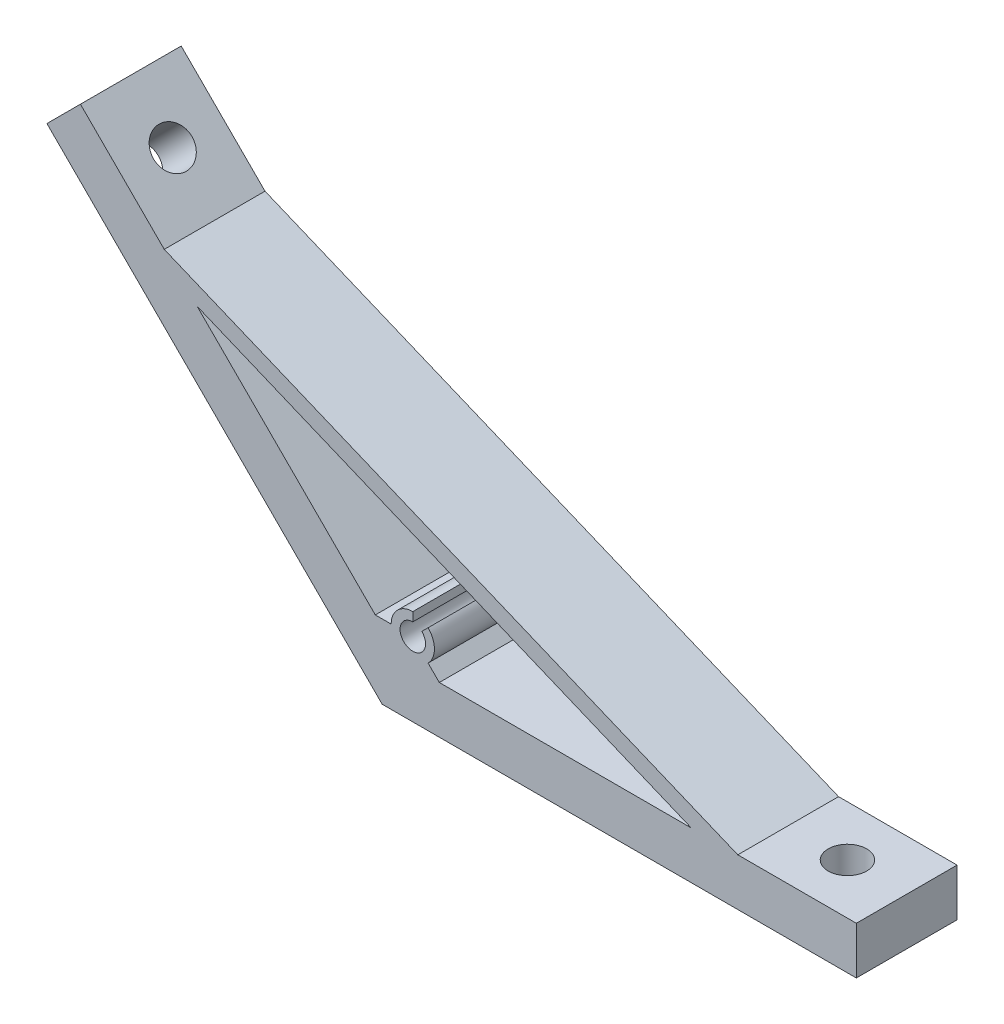
ISO-10303-21;
HEADER;
FILE_DESCRIPTION(('STEP AP214'),'2;1');
FILE_NAME('part.step','',(''),(''),'','','');
FILE_SCHEMA(('AUTOMOTIVE_DESIGN { 1 0 10303 214 1 1 1 1 }'));
ENDSEC;
DATA;
#1=APPLICATION_CONTEXT('core data for automotive mechanical design processes');
#2=APPLICATION_PROTOCOL_DEFINITION('international standard','automotive_design',2000,#1);
#3=PRODUCT_CONTEXT('',#1,'mechanical');
#4=PRODUCT('Part','Part','',(#3));
#5=PRODUCT_RELATED_PRODUCT_CATEGORY('part','',(#4));
#6=PRODUCT_DEFINITION_FORMATION('','',#4);
#7=PRODUCT_DEFINITION_CONTEXT('part definition',#1,'design');
#8=PRODUCT_DEFINITION('design','',#6,#7);
#9=PRODUCT_DEFINITION_SHAPE('','',#8);
#10=(LENGTH_UNIT() NAMED_UNIT(*) SI_UNIT(.MILLI.,.METRE.));
#11=(NAMED_UNIT(*) PLANE_ANGLE_UNIT() SI_UNIT($,.RADIAN.));
#12=(NAMED_UNIT(*) SI_UNIT($,.STERADIAN.) SOLID_ANGLE_UNIT());
#13=UNCERTAINTY_MEASURE_WITH_UNIT(LENGTH_MEASURE(1.E-05),#10,'distance_accuracy_value','');
#14=(GEOMETRIC_REPRESENTATION_CONTEXT(3) GLOBAL_UNCERTAINTY_ASSIGNED_CONTEXT((#13)) GLOBAL_UNIT_ASSIGNED_CONTEXT((#10,
#11,#12)) REPRESENTATION_CONTEXT('',''));
#15=CARTESIAN_POINT('',(0.,0.,0.));
#16=DIRECTION('',(0.,0.,1.));
#17=DIRECTION('',(1.,0.,0.));
#18=AXIS2_PLACEMENT_3D('',#15,#16,#17);
#19=CARTESIAN_POINT('',(-36.7695526216999,48.0832611206847,8.5));
#20=DIRECTION('',(-0.707106781186536,-0.707106781186559,0.));
#21=DIRECTION('',(0.707106781186559,-0.707106781186536,0.));
#22=AXIS2_PLACEMENT_3D('',#19,#20,#21);
#23=PLANE('',#22);
#24=DIRECTION('',(-0.707106781186559,0.707106781186536,0.));
#25=VECTOR('',#24,1.);
#26=CARTESIAN_POINT('',(-36.7695526216999,48.0832611206847,-8.5));
#27=LINE('',#26,#25);
#28=CARTESIAN_POINT('',(-36.7695526216999,48.0832611206847,-8.5));
#29=VERTEX_POINT('',#28);
#30=CARTESIAN_POINT('',(-50.9116882454318,62.2253967444162,-8.5));
#31=VERTEX_POINT('',#30);
#32=EDGE_CURVE('E260',#29,#31,#27,.T.);
#33=ORIENTED_EDGE('',*,*,#32,.T.);
#34=DIRECTION('',(0.,0.,-1.));
#35=VECTOR('',#34,1.);
#36=CARTESIAN_POINT('',(-50.9116882454318,62.2253967444162,8.5));
#37=LINE('',#36,#35);
#38=CARTESIAN_POINT('',(-50.9116882454318,62.2253967444162,8.5));
#39=VERTEX_POINT('',#38);
#40=EDGE_CURVE('E275',#39,#31,#37,.T.);
#41=ORIENTED_EDGE('',*,*,#40,.F.);
#42=DIRECTION('',(-0.707106781186559,0.707106781186536,0.));
#43=VECTOR('',#42,1.);
#44=CARTESIAN_POINT('',(-36.7695526216999,48.0832611206847,8.5));
#45=LINE('',#44,#43);
#46=CARTESIAN_POINT('',(-36.7695526216999,48.0832611206847,8.5));
#47=VERTEX_POINT('',#46);
#48=EDGE_CURVE('E245',#47,#39,#45,.T.);
#49=ORIENTED_EDGE('',*,*,#48,.F.);
#50=DIRECTION('',(0.,0.,-1.));
#51=VECTOR('',#50,1.);
#52=CARTESIAN_POINT('',(-36.7695526216999,48.0832611206847,8.5));
#53=LINE('',#52,#51);
#54=EDGE_CURVE('E278',#47,#29,#53,.T.);
#55=ORIENTED_EDGE('',*,*,#54,.T.);
#56=EDGE_LOOP('',(#33,#41,#49,#55));
#57=FACE_BOUND('',#56,.T.);
#58=CARTESIAN_POINT('',(-43.840620433566,55.1543289325507,0.));
#59=DIRECTION('',(-0.707106781186552,-0.707106781186543,0.));
#60=DIRECTION('',(0.707106781186543,-0.707106781186552,0.));
#61=AXIS2_PLACEMENT_3D('',#58,#59,#60);
#62=CIRCLE('',#61,3.25000000000001);
#63=CARTESIAN_POINT('',(-46.1387174724223,57.452425971407,0.));
#64=VERTEX_POINT('',#63);
#65=EDGE_CURVE('E325',#64,#64,#62,.T.);
#66=ORIENTED_EDGE('',*,*,#65,.T.);
#67=EDGE_LOOP('',(#66));
#68=FACE_BOUND('',#67,.T.);
#69=ADVANCED_FACE('F35',(#57,#68),#23,.F.);
#70=CARTESIAN_POINT('',(0.,0.,8.5));
#71=DIRECTION('',(0.707106781186545,0.70710678118655,0.));
#72=DIRECTION('',(-0.70710678118655,0.707106781186545,0.));
#73=AXIS2_PLACEMENT_3D('',#70,#71,#72);
#74=PLANE('',#73);
#75=DIRECTION('',(0.70710678118655,-0.707106781186545,0.));
#76=VECTOR('',#75,1.);
#77=CARTESIAN_POINT('',(0.,0.,-8.5));
#78=LINE('',#77,#76);
#79=CARTESIAN_POINT('',(-56.5685424949243,56.5685424949238,-8.5));
#80=VERTEX_POINT('',#79);
#81=CARTESIAN_POINT('',(0.,0.,-8.5));
#82=VERTEX_POINT('',#81);
#83=EDGE_CURVE('E264',#80,#82,#78,.T.);
#84=ORIENTED_EDGE('',*,*,#83,.T.);
#85=DIRECTION('',(0.,0.,-1.));
#86=VECTOR('',#85,1.);
#87=CARTESIAN_POINT('',(0.,0.,8.5));
#88=LINE('',#87,#86);
#89=CARTESIAN_POINT('',(0.,0.,8.5));
#90=VERTEX_POINT('',#89);
#91=EDGE_CURVE('E269',#90,#82,#88,.T.);
#92=ORIENTED_EDGE('',*,*,#91,.F.);
#93=DIRECTION('',(0.70710678118655,-0.707106781186545,0.));
#94=VECTOR('',#93,1.);
#95=CARTESIAN_POINT('',(0.,0.,8.5));
#96=LINE('',#95,#94);
#97=CARTESIAN_POINT('',(-56.5685424949243,56.5685424949238,8.5));
#98=VERTEX_POINT('',#97);
#99=EDGE_CURVE('E249',#98,#90,#96,.T.);
#100=ORIENTED_EDGE('',*,*,#99,.F.);
#101=DIRECTION('',(0.,0.,-1.));
#102=VECTOR('',#101,1.);
#103=CARTESIAN_POINT('',(-56.5685424949243,56.5685424949238,8.5));
#104=LINE('',#103,#102);
#105=EDGE_CURVE('E272',#98,#80,#104,.T.);
#106=ORIENTED_EDGE('',*,*,#105,.T.);
#107=EDGE_LOOP('',(#84,#92,#100,#106));
#108=FACE_BOUND('',#107,.T.);
#109=CARTESIAN_POINT('',(-49.4974746830586,49.4974746830582,0.));
#110=DIRECTION('',(0.707106781186545,0.70710678118655,0.));
#111=DIRECTION('',(-0.70710678118655,0.707106781186545,0.));
#112=AXIS2_PLACEMENT_3D('',#109,#110,#111);
#113=CIRCLE('',#112,3.25000000000001);
#114=CARTESIAN_POINT('',(-51.7955717219149,51.7955717219144,0.));
#115=VERTEX_POINT('',#114);
#116=EDGE_CURVE('E39',#115,#115,#113,.F.);
#117=ORIENTED_EDGE('',*,*,#116,.F.);
#118=EDGE_LOOP('',(#117));
#119=FACE_BOUND('',#118,.T.);
#120=ADVANCED_FACE('F317',(#108,#119),#74,.F.);
#121=CARTESIAN_POINT('',(0.,0.,8.5));
#122=DIRECTION('',(0.,0.,-1.));
#123=DIRECTION('',(-1.,0.,0.));
#124=AXIS2_PLACEMENT_3D('',#121,#122,#123);
#125=PLANE('',#124);
#126=DIRECTION('',(0.,1.,0.));
#127=VECTOR('',#126,1.);
#128=CARTESIAN_POINT('',(80.,8.,8.5));
#129=LINE('',#128,#127);
#130=CARTESIAN_POINT('',(80.,0.,8.5));
#131=VERTEX_POINT('',#130);
#132=CARTESIAN_POINT('',(80.,8.,8.5));
#133=VERTEX_POINT('',#132);
#134=EDGE_CURVE('E237',#131,#133,#129,.T.);
#135=ORIENTED_EDGE('',*,*,#134,.T.);
#136=DIRECTION('',(-1.,0.,0.));
#137=VECTOR('',#136,1.);
#138=CARTESIAN_POINT('',(80.,8.,8.5));
#139=LINE('',#138,#137);
#140=CARTESIAN_POINT('',(59.9999999999991,7.99999999999989,8.5));
#141=VERTEX_POINT('',#140);
#142=EDGE_CURVE('E240',#133,#141,#139,.T.);
#143=ORIENTED_EDGE('',*,*,#142,.T.);
#144=DIRECTION('',(-0.923879532511286,0.382683432365092,0.));
#145=VECTOR('',#144,1.);
#146=CARTESIAN_POINT('',(-36.7695526216999,48.0832611206847,8.5));
#147=LINE('',#146,#145);
#148=EDGE_CURVE('E243',#141,#47,#147,.T.);
#149=ORIENTED_EDGE('',*,*,#148,.T.);
#150=ORIENTED_EDGE('',*,*,#48,.T.);
#151=DIRECTION('',(-0.707106781186548,-0.707106781186548,0.));
#152=VECTOR('',#151,1.);
#153=CARTESIAN_POINT('',(-50.9116882454318,62.2253967444162,8.5));
#154=LINE('',#153,#152);
#155=EDGE_CURVE('E247',#39,#98,#154,.T.);
#156=ORIENTED_EDGE('',*,*,#155,.T.);
#157=ORIENTED_EDGE('',*,*,#99,.T.);
#158=DIRECTION('',(1.,0.,0.));
#159=VECTOR('',#158,1.);
#160=CARTESIAN_POINT('',(80.,0.,8.5));
#161=LINE('',#160,#159);
#162=EDGE_CURVE('E251',#90,#131,#161,.T.);
#163=ORIENTED_EDGE('',*,*,#162,.T.);
#164=EDGE_LOOP('',(#135,#143,#149,#150,#156,#157,#163));
#165=FACE_BOUND('',#164,.T.);
#166=DIRECTION('',(-0.92387953251129,0.382683432365082,0.));
#167=VECTOR('',#166,1.);
#168=CARTESIAN_POINT('',(-31.2262754266308,42.5399839256161,8.5));
#169=LINE('',#168,#167);
#170=CARTESIAN_POINT('',(52.1606222107425,7.99999999999989,8.5));
#171=VERTEX_POINT('',#170);
#172=CARTESIAN_POINT('',(-31.2262754266308,42.5399839256161,8.5));
#173=VERTEX_POINT('',#172);
#174=EDGE_CURVE('E155',#171,#173,#169,.T.);
#175=ORIENTED_EDGE('',*,*,#174,.F.);
#176=DIRECTION('',(1.,0.,0.));
#177=VECTOR('',#176,1.);
#178=CARTESIAN_POINT('',(52.1606222107425,7.99999999999989,8.5));
#179=LINE('',#178,#177);
#180=CARTESIAN_POINT('',(9.63860002583124,8.,8.5));
#181=VERTEX_POINT('',#180);
#182=EDGE_CURVE('E194',#181,#171,#179,.T.);
#183=ORIENTED_EDGE('',*,*,#182,.F.);
#184=DIRECTION('',(0.70710678118647,-0.707106781186625,0.));
#185=VECTOR('',#184,1.);
#186=CARTESIAN_POINT('',(9.63860002583124,8.,8.5));
#187=LINE('',#186,#185);
#188=CARTESIAN_POINT('',(7.74716608826006,9.89143393757159,8.5));
#189=VERTEX_POINT('',#188);
#190=EDGE_CURVE('E192',#189,#181,#187,.T.);
#191=ORIENTED_EDGE('',*,*,#190,.F.);
#192=CARTESIAN_POINT('',(5.16622633692896,12.4723736889023,8.5));
#193=DIRECTION('',(0.,0.,-1.));
#194=DIRECTION('',(1.,0.,0.));
#195=AXIS2_PLACEMENT_3D('',#192,#193,#194);
#196=CIRCLE('',#195,3.65);
#197=CARTESIAN_POINT('',(7.74716608826007,15.053313440233,8.5));
#198=VERTEX_POINT('',#197);
#199=EDGE_CURVE('E190',#198,#189,#196,.T.);
#200=ORIENTED_EDGE('',*,*,#199,.F.);
#201=DIRECTION('',(0.707106781186523,0.707106781186572,0.));
#202=VECTOR('',#201,1.);
#203=CARTESIAN_POINT('',(6.68650591648028,13.9926532684531,8.5));
#204=LINE('',#203,#202);
#205=CARTESIAN_POINT('',(6.68650591648028,13.9926532684531,8.5));
#206=VERTEX_POINT('',#205);
#207=EDGE_CURVE('E188',#206,#198,#204,.T.);
#208=ORIENTED_EDGE('',*,*,#207,.F.);
#209=CARTESIAN_POINT('',(5.16622633692896,12.4723736889023,8.5));
#210=DIRECTION('',(0.,0.,1.));
#211=DIRECTION('',(1.,0.,0.));
#212=AXIS2_PLACEMENT_3D('',#209,#210,#211);
#213=CIRCLE('',#212,2.15);
#214=CARTESIAN_POINT('',(5.16622633692896,14.6223736889023,8.5));
#215=VERTEX_POINT('',#214);
#216=EDGE_CURVE('E186',#215,#206,#213,.T.);
#217=ORIENTED_EDGE('',*,*,#216,.F.);
#218=DIRECTION('',(0.,-1.,0.));
#219=VECTOR('',#218,1.);
#220=CARTESIAN_POINT('',(5.16622633692896,14.6223736889023,8.5));
#221=LINE('',#220,#219);
#222=CARTESIAN_POINT('',(5.16622633692896,16.1223736889023,8.5));
#223=VERTEX_POINT('',#222);
#224=EDGE_CURVE('E184',#223,#215,#221,.T.);
#225=ORIENTED_EDGE('',*,*,#224,.F.);
#226=CARTESIAN_POINT('',(5.16622633692896,12.4723736889023,8.5));
#227=DIRECTION('',(0.,0.,-1.));
#228=DIRECTION('',(1.,0.,0.));
#229=AXIS2_PLACEMENT_3D('',#226,#227,#228);
#230=CIRCLE('',#229,3.65);
#231=CARTESIAN_POINT('',(1.51622633692896,12.4723736889023,8.5));
#232=VERTEX_POINT('',#231);
#233=EDGE_CURVE('E179',#232,#223,#230,.T.);
#234=ORIENTED_EDGE('',*,*,#233,.F.);
#235=DIRECTION('',(1.,0.,0.));
#236=VECTOR('',#235,1.);
#237=CARTESIAN_POINT('',(-1.15866518991743,12.4723736889023,8.5));
#238=LINE('',#237,#236);
#239=CARTESIAN_POINT('',(-1.15866518991743,12.4723736889023,8.5));
#240=VERTEX_POINT('',#239);
#241=EDGE_CURVE('E177',#240,#232,#238,.T.);
#242=ORIENTED_EDGE('',*,*,#241,.F.);
#243=DIRECTION('',(0.707106781186542,-0.707106781186553,0.));
#244=VECTOR('',#243,1.);
#245=CARTESIAN_POINT('',(-1.15866518991743,12.4723736889023,8.5));
#246=LINE('',#245,#244);
#247=EDGE_CURVE('E163',#173,#240,#246,.T.);
#248=ORIENTED_EDGE('',*,*,#247,.F.);
#249=EDGE_LOOP('',(#175,#183,#191,#200,#208,#217,#225,#234,#242,#248));
#250=FACE_BOUND('',#249,.T.);
#251=ADVANCED_FACE('F175',(#165,#250),#125,.F.);
#252=CARTESIAN_POINT('',(0.,0.,-8.5));
#253=DIRECTION('',(0.,0.,-1.));
#254=DIRECTION('',(-1.,0.,0.));
#255=AXIS2_PLACEMENT_3D('',#252,#253,#254);
#256=PLANE('',#255);
#257=DIRECTION('',(0.,1.,0.));
#258=VECTOR('',#257,1.);
#259=CARTESIAN_POINT('',(80.,8.,-8.5));
#260=LINE('',#259,#258);
#261=CARTESIAN_POINT('',(80.,0.,-8.5));
#262=VERTEX_POINT('',#261);
#263=CARTESIAN_POINT('',(80.,8.,-8.5));
#264=VERTEX_POINT('',#263);
#265=EDGE_CURVE('E171',#262,#264,#260,.T.);
#266=ORIENTED_EDGE('',*,*,#265,.F.);
#267=DIRECTION('',(1.,0.,0.));
#268=VECTOR('',#267,1.);
#269=CARTESIAN_POINT('',(80.,0.,-8.5));
#270=LINE('',#269,#268);
#271=EDGE_CURVE('E241',#82,#262,#270,.T.);
#272=ORIENTED_EDGE('',*,*,#271,.F.);
#273=ORIENTED_EDGE('',*,*,#83,.F.);
#274=DIRECTION('',(-0.707106781186548,-0.707106781186548,0.));
#275=VECTOR('',#274,1.);
#276=CARTESIAN_POINT('',(-50.9116882454318,62.2253967444162,-8.5));
#277=LINE('',#276,#275);
#278=EDGE_CURVE('E262',#31,#80,#277,.T.);
#279=ORIENTED_EDGE('',*,*,#278,.F.);
#280=ORIENTED_EDGE('',*,*,#32,.F.);
#281=DIRECTION('',(-0.923879532511286,0.382683432365092,0.));
#282=VECTOR('',#281,1.);
#283=CARTESIAN_POINT('',(-36.7695526216999,48.0832611206847,-8.5));
#284=LINE('',#283,#282);
#285=CARTESIAN_POINT('',(59.9999999999991,7.99999999999989,-8.5));
#286=VERTEX_POINT('',#285);
#287=EDGE_CURVE('E258',#286,#29,#284,.T.);
#288=ORIENTED_EDGE('',*,*,#287,.F.);
#289=DIRECTION('',(-1.,0.,0.));
#290=VECTOR('',#289,1.);
#291=CARTESIAN_POINT('',(80.,8.,-8.5));
#292=LINE('',#291,#290);
#293=EDGE_CURVE('E256',#264,#286,#292,.T.);
#294=ORIENTED_EDGE('',*,*,#293,.F.);
#295=EDGE_LOOP('',(#266,#272,#273,#279,#280,#288,#294));
#296=FACE_BOUND('',#295,.T.);
#297=DIRECTION('',(1.,0.,0.));
#298=VECTOR('',#297,1.);
#299=CARTESIAN_POINT('',(52.1606222107425,7.99999999999989,-8.5));
#300=LINE('',#299,#298);
#301=CARTESIAN_POINT('',(9.63860002583124,8.,-8.5));
#302=VERTEX_POINT('',#301);
#303=CARTESIAN_POINT('',(52.1606222107425,7.99999999999989,-8.5));
#304=VERTEX_POINT('',#303);
#305=EDGE_CURVE('E164',#302,#304,#300,.T.);
#306=ORIENTED_EDGE('',*,*,#305,.T.);
#307=DIRECTION('',(-0.92387953251129,0.382683432365082,0.));
#308=VECTOR('',#307,1.);
#309=CARTESIAN_POINT('',(-31.2262754266308,42.5399839256161,-8.5));
#310=LINE('',#309,#308);
#311=CARTESIAN_POINT('',(-31.2262754266308,42.5399839256161,-8.5));
#312=VERTEX_POINT('',#311);
#313=EDGE_CURVE('E59',#304,#312,#310,.T.);
#314=ORIENTED_EDGE('',*,*,#313,.T.);
#315=DIRECTION('',(0.707106781186542,-0.707106781186553,0.));
#316=VECTOR('',#315,1.);
#317=CARTESIAN_POINT('',(-1.15866518991743,12.4723736889023,-8.5));
#318=LINE('',#317,#316);
#319=CARTESIAN_POINT('',(-1.15866518991743,12.4723736889023,-8.5));
#320=VERTEX_POINT('',#319);
#321=EDGE_CURVE('E170',#312,#320,#318,.T.);
#322=ORIENTED_EDGE('',*,*,#321,.T.);
#323=DIRECTION('',(1.,0.,0.));
#324=VECTOR('',#323,1.);
#325=CARTESIAN_POINT('',(-1.15866518991743,12.4723736889023,-8.5));
#326=LINE('',#325,#324);
#327=CARTESIAN_POINT('',(1.51622633692896,12.4723736889023,-8.5));
#328=VERTEX_POINT('',#327);
#329=EDGE_CURVE('E199',#320,#328,#326,.T.);
#330=ORIENTED_EDGE('',*,*,#329,.T.);
#331=CARTESIAN_POINT('',(5.16622633692896,12.4723736889023,-8.5));
#332=DIRECTION('',(0.,0.,-1.));
#333=DIRECTION('',(1.,0.,0.));
#334=AXIS2_PLACEMENT_3D('',#331,#332,#333);
#335=CIRCLE('',#334,3.65);
#336=CARTESIAN_POINT('',(5.16622633692896,16.1223736889023,-8.5));
#337=VERTEX_POINT('',#336);
#338=EDGE_CURVE('E202',#328,#337,#335,.T.);
#339=ORIENTED_EDGE('',*,*,#338,.T.);
#340=DIRECTION('',(0.,-1.,0.));
#341=VECTOR('',#340,1.);
#342=CARTESIAN_POINT('',(5.16622633692896,14.6223736889023,-8.5));
#343=LINE('',#342,#341);
#344=CARTESIAN_POINT('',(5.16622633692896,14.6223736889023,-8.5));
#345=VERTEX_POINT('',#344);
#346=EDGE_CURVE('E205',#337,#345,#343,.T.);
#347=ORIENTED_EDGE('',*,*,#346,.T.);
#348=CARTESIAN_POINT('',(5.16622633692896,12.4723736889023,-8.5));
#349=DIRECTION('',(0.,0.,1.));
#350=DIRECTION('',(1.,0.,0.));
#351=AXIS2_PLACEMENT_3D('',#348,#349,#350);
#352=CIRCLE('',#351,2.15);
#353=CARTESIAN_POINT('',(6.68650591648028,13.9926532684531,-8.5));
#354=VERTEX_POINT('',#353);
#355=EDGE_CURVE('E208',#345,#354,#352,.T.);
#356=ORIENTED_EDGE('',*,*,#355,.T.);
#357=DIRECTION('',(0.707106781186523,0.707106781186572,0.));
#358=VECTOR('',#357,1.);
#359=CARTESIAN_POINT('',(6.68650591648028,13.9926532684531,-8.5));
#360=LINE('',#359,#358);
#361=CARTESIAN_POINT('',(7.74716608826007,15.053313440233,-8.5));
#362=VERTEX_POINT('',#361);
#363=EDGE_CURVE('E211',#354,#362,#360,.T.);
#364=ORIENTED_EDGE('',*,*,#363,.T.);
#365=CARTESIAN_POINT('',(5.16622633692896,12.4723736889023,-8.5));
#366=DIRECTION('',(0.,0.,-1.));
#367=DIRECTION('',(1.,0.,0.));
#368=AXIS2_PLACEMENT_3D('',#365,#366,#367);
#369=CIRCLE('',#368,3.65);
#370=CARTESIAN_POINT('',(7.74716608826006,9.89143393757159,-8.5));
#371=VERTEX_POINT('',#370);
#372=EDGE_CURVE('E214',#362,#371,#369,.T.);
#373=ORIENTED_EDGE('',*,*,#372,.T.);
#374=DIRECTION('',(0.70710678118647,-0.707106781186625,0.));
#375=VECTOR('',#374,1.);
#376=CARTESIAN_POINT('',(9.63860002583124,8.,-8.5));
#377=LINE('',#376,#375);
#378=EDGE_CURVE('E217',#371,#302,#377,.T.);
#379=ORIENTED_EDGE('',*,*,#378,.T.);
#380=EDGE_LOOP('',(#306,#314,#322,#330,#339,#347,#356,#364,#373,#379));
#381=FACE_BOUND('',#380,.T.);
#382=ADVANCED_FACE('F292',(#296,#381),#256,.T.);
#383=CARTESIAN_POINT('',(80.,8.,8.5));
#384=DIRECTION('',(-1.,0.,0.));
#385=DIRECTION('',(0.,0.,1.));
#386=AXIS2_PLACEMENT_3D('',#383,#384,#385);
#387=PLANE('',#386);
#388=ORIENTED_EDGE('',*,*,#265,.T.);
#389=DIRECTION('',(0.,0.,-1.));
#390=VECTOR('',#389,1.);
#391=CARTESIAN_POINT('',(80.,8.,8.5));
#392=LINE('',#391,#390);
#393=EDGE_CURVE('E11',#133,#264,#392,.T.);
#394=ORIENTED_EDGE('',*,*,#393,.F.);
#395=ORIENTED_EDGE('',*,*,#134,.F.);
#396=DIRECTION('',(0.,0.,-1.));
#397=VECTOR('',#396,1.);
#398=CARTESIAN_POINT('',(80.,0.,8.5));
#399=LINE('',#398,#397);
#400=EDGE_CURVE('E253',#131,#262,#399,.T.);
#401=ORIENTED_EDGE('',*,*,#400,.T.);
#402=EDGE_LOOP('',(#388,#394,#395,#401));
#403=FACE_BOUND('',#402,.T.);
#404=ADVANCED_FACE('F37',(#403),#387,.F.);
#405=CARTESIAN_POINT('',(80.,8.,8.5));
#406=DIRECTION('',(0.,-1.,0.));
#407=DIRECTION('',(1.,0.,0.));
#408=AXIS2_PLACEMENT_3D('',#405,#406,#407);
#409=PLANE('',#408);
#410=CARTESIAN_POINT('',(70.,7.99999999999994,0.));
#411=DIRECTION('',(0.,1.,0.));
#412=DIRECTION('',(-1.,0.,0.));
#413=AXIS2_PLACEMENT_3D('',#410,#411,#412);
#414=CIRCLE('',#413,3.25000000000001);
#415=CARTESIAN_POINT('',(66.75,7.99999999999992,0.));
#416=VERTEX_POINT('',#415);
#417=EDGE_CURVE('E324',#416,#416,#414,.T.);
#418=ORIENTED_EDGE('',*,*,#417,.F.);
#419=EDGE_LOOP('',(#418));
#420=FACE_BOUND('',#419,.T.);
#421=ORIENTED_EDGE('',*,*,#293,.T.);
#422=DIRECTION('',(0.,0.,-1.));
#423=VECTOR('',#422,1.);
#424=CARTESIAN_POINT('',(59.9999999999991,7.99999999999989,8.5));
#425=LINE('',#424,#423);
#426=EDGE_CURVE('E44',#141,#286,#425,.T.);
#427=ORIENTED_EDGE('',*,*,#426,.F.);
#428=ORIENTED_EDGE('',*,*,#142,.F.);
#429=ORIENTED_EDGE('',*,*,#393,.T.);
#430=EDGE_LOOP('',(#421,#427,#428,#429));
#431=FACE_BOUND('',#430,.T.);
#432=ADVANCED_FACE('F309',(#420,#431),#409,.F.);
#433=CARTESIAN_POINT('',(-36.7695526216999,48.0832611206847,8.5));
#434=DIRECTION('',(-0.382683432365092,-0.923879532511286,0.));
#435=DIRECTION('',(0.923879532511286,-0.382683432365092,0.));
#436=AXIS2_PLACEMENT_3D('',#433,#434,#435);
#437=PLANE('',#436);
#438=ORIENTED_EDGE('',*,*,#287,.T.);
#439=ORIENTED_EDGE('',*,*,#54,.F.);
#440=ORIENTED_EDGE('',*,*,#148,.F.);
#441=ORIENTED_EDGE('',*,*,#426,.T.);
#442=EDGE_LOOP('',(#438,#439,#440,#441));
#443=FACE_BOUND('',#442,.T.);
#444=ADVANCED_FACE('F286',(#443),#437,.F.);
#445=CARTESIAN_POINT('',(-50.9116882454318,62.2253967444162,8.5));
#446=DIRECTION('',(0.707106781186547,-0.707106781186547,0.));
#447=DIRECTION('',(0.707106781186548,0.707106781186548,0.));
#448=AXIS2_PLACEMENT_3D('',#445,#446,#447);
#449=PLANE('',#448);
#450=ORIENTED_EDGE('',*,*,#278,.T.);
#451=ORIENTED_EDGE('',*,*,#105,.F.);
#452=ORIENTED_EDGE('',*,*,#155,.F.);
#453=ORIENTED_EDGE('',*,*,#40,.T.);
#454=EDGE_LOOP('',(#450,#451,#452,#453));
#455=FACE_BOUND('',#454,.T.);
#456=ADVANCED_FACE('F302',(#455),#449,.F.);
#457=CARTESIAN_POINT('',(80.,0.,8.5));
#458=DIRECTION('',(0.,1.,0.));
#459=DIRECTION('',(0.,0.,1.));
#460=AXIS2_PLACEMENT_3D('',#457,#458,#459);
#461=PLANE('',#460);
#462=CARTESIAN_POINT('',(70.,0.,0.));
#463=DIRECTION('',(0.,1.,0.));
#464=DIRECTION('',(-1.,0.,0.));
#465=AXIS2_PLACEMENT_3D('',#462,#463,#464);
#466=CIRCLE('',#465,3.25000000000001);
#467=CARTESIAN_POINT('',(66.75,0.,0.));
#468=VERTEX_POINT('',#467);
#469=EDGE_CURVE('E197',#468,#468,#466,.T.);
#470=ORIENTED_EDGE('',*,*,#469,.T.);
#471=EDGE_LOOP('',(#470));
#472=FACE_BOUND('',#471,.T.);
#473=ORIENTED_EDGE('',*,*,#271,.T.);
#474=ORIENTED_EDGE('',*,*,#400,.F.);
#475=ORIENTED_EDGE('',*,*,#162,.F.);
#476=ORIENTED_EDGE('',*,*,#91,.T.);
#477=EDGE_LOOP('',(#473,#474,#475,#476));
#478=FACE_BOUND('',#477,.T.);
#479=ADVANCED_FACE('F314',(#472,#478),#461,.F.);
#480=CARTESIAN_POINT('',(-31.2262754266308,42.5399839256161,8.5));
#481=DIRECTION('',(-0.382683432365082,-0.92387953251129,0.));
#482=DIRECTION('',(0.92387953251129,-0.382683432365082,0.));
#483=AXIS2_PLACEMENT_3D('',#480,#481,#482);
#484=PLANE('',#483);
#485=ORIENTED_EDGE('',*,*,#313,.F.);
#486=DIRECTION('',(0.,0.,-1.));
#487=VECTOR('',#486,1.);
#488=CARTESIAN_POINT('',(52.1606222107425,7.99999999999989,8.5));
#489=LINE('',#488,#487);
#490=EDGE_CURVE('E159',#171,#304,#489,.T.);
#491=ORIENTED_EDGE('',*,*,#490,.F.);
#492=ORIENTED_EDGE('',*,*,#174,.T.);
#493=DIRECTION('',(0.,0.,-1.));
#494=VECTOR('',#493,1.);
#495=CARTESIAN_POINT('',(-31.2262754266308,42.5399839256161,8.5));
#496=LINE('',#495,#494);
#497=EDGE_CURVE('E158',#173,#312,#496,.T.);
#498=ORIENTED_EDGE('',*,*,#497,.T.);
#499=EDGE_LOOP('',(#485,#491,#492,#498));
#500=FACE_BOUND('',#499,.T.);
#501=ADVANCED_FACE('F157',(#500),#484,.T.);
#502=CARTESIAN_POINT('',(-1.15866518991743,12.4723736889023,8.5));
#503=DIRECTION('',(0.707106781186553,0.707106781186542,0.));
#504=DIRECTION('',(-0.707106781186542,0.707106781186553,0.));
#505=AXIS2_PLACEMENT_3D('',#502,#503,#504);
#506=PLANE('',#505);
#507=ORIENTED_EDGE('',*,*,#321,.F.);
#508=ORIENTED_EDGE('',*,*,#497,.F.);
#509=ORIENTED_EDGE('',*,*,#247,.T.);
#510=DIRECTION('',(0.,0.,-1.));
#511=VECTOR('',#510,1.);
#512=CARTESIAN_POINT('',(-1.15866518991743,12.4723736889023,8.5));
#513=LINE('',#512,#511);
#514=EDGE_CURVE('E172',#240,#320,#513,.T.);
#515=ORIENTED_EDGE('',*,*,#514,.T.);
#516=EDGE_LOOP('',(#507,#508,#509,#515));
#517=FACE_BOUND('',#516,.T.);
#518=ADVANCED_FACE('F167',(#517),#506,.T.);
#519=CARTESIAN_POINT('',(-1.15866518991743,12.4723736889023,8.5));
#520=DIRECTION('',(0.,1.,0.));
#521=DIRECTION('',(0.,0.,1.));
#522=AXIS2_PLACEMENT_3D('',#519,#520,#521);
#523=PLANE('',#522);
#524=ORIENTED_EDGE('',*,*,#329,.F.);
#525=ORIENTED_EDGE('',*,*,#514,.F.);
#526=ORIENTED_EDGE('',*,*,#241,.T.);
#527=DIRECTION('',(0.,0.,-1.));
#528=VECTOR('',#527,1.);
#529=CARTESIAN_POINT('',(1.51622633692896,12.4723736889023,8.5));
#530=LINE('',#529,#528);
#531=EDGE_CURVE('E234',#232,#328,#530,.T.);
#532=ORIENTED_EDGE('',*,*,#531,.T.);
#533=EDGE_LOOP('',(#524,#525,#526,#532));
#534=FACE_BOUND('',#533,.T.);
#535=ADVANCED_FACE('F366',(#534),#523,.T.);
#536=CARTESIAN_POINT('',(5.16622633692896,12.4723736889023,8.5));
#537=DIRECTION('',(0.,0.,-1.));
#538=DIRECTION('',(-1.,0.,0.));
#539=AXIS2_PLACEMENT_3D('',#536,#537,#538);
#540=CYLINDRICAL_SURFACE('',#539,3.65);
#541=ORIENTED_EDGE('',*,*,#338,.F.);
#542=ORIENTED_EDGE('',*,*,#531,.F.);
#543=ORIENTED_EDGE('',*,*,#233,.T.);
#544=DIRECTION('',(0.,0.,-1.));
#545=VECTOR('',#544,1.);
#546=CARTESIAN_POINT('',(5.16622633692896,16.1223736889023,8.5));
#547=LINE('',#546,#545);
#548=EDGE_CURVE('E232',#223,#337,#547,.T.);
#549=ORIENTED_EDGE('',*,*,#548,.T.);
#550=EDGE_LOOP('',(#541,#542,#543,#549));
#551=FACE_BOUND('',#550,.T.);
#552=ADVANCED_FACE('F369',(#551),#540,.T.);
#553=CARTESIAN_POINT('',(5.16622633692896,14.6223736889023,8.5));
#554=DIRECTION('',(1.,0.,0.));
#555=DIRECTION('',(0.,0.,-1.));
#556=AXIS2_PLACEMENT_3D('',#553,#554,#555);
#557=PLANE('',#556);
#558=ORIENTED_EDGE('',*,*,#346,.F.);
#559=ORIENTED_EDGE('',*,*,#548,.F.);
#560=ORIENTED_EDGE('',*,*,#224,.T.);
#561=DIRECTION('',(0.,0.,-1.));
#562=VECTOR('',#561,1.);
#563=CARTESIAN_POINT('',(5.16622633692896,14.6223736889023,8.5));
#564=LINE('',#563,#562);
#565=EDGE_CURVE('E230',#215,#345,#564,.T.);
#566=ORIENTED_EDGE('',*,*,#565,.T.);
#567=EDGE_LOOP('',(#558,#559,#560,#566));
#568=FACE_BOUND('',#567,.T.);
#569=ADVANCED_FACE('F373',(#568),#557,.T.);
#570=CARTESIAN_POINT('',(5.16622633692896,12.4723736889023,8.5));
#571=DIRECTION('',(0.,0.,-1.));
#572=DIRECTION('',(-1.,0.,0.));
#573=AXIS2_PLACEMENT_3D('',#570,#571,#572);
#574=CYLINDRICAL_SURFACE('',#573,2.15);
#575=ORIENTED_EDGE('',*,*,#355,.F.);
#576=ORIENTED_EDGE('',*,*,#565,.F.);
#577=ORIENTED_EDGE('',*,*,#216,.T.);
#578=DIRECTION('',(0.,0.,-1.));
#579=VECTOR('',#578,1.);
#580=CARTESIAN_POINT('',(6.68650591648028,13.9926532684531,8.5));
#581=LINE('',#580,#579);
#582=EDGE_CURVE('E228',#206,#354,#581,.T.);
#583=ORIENTED_EDGE('',*,*,#582,.T.);
#584=EDGE_LOOP('',(#575,#576,#577,#583));
#585=FACE_BOUND('',#584,.T.);
#586=ADVANCED_FACE('F377',(#585),#574,.F.);
#587=CARTESIAN_POINT('',(6.68650591648028,13.9926532684531,8.5));
#588=DIRECTION('',(-0.707106781186572,0.707106781186523,0.));
#589=DIRECTION('',(-0.707106781186523,-0.707106781186572,0.));
#590=AXIS2_PLACEMENT_3D('',#587,#588,#589);
#591=PLANE('',#590);
#592=ORIENTED_EDGE('',*,*,#363,.F.);
#593=ORIENTED_EDGE('',*,*,#582,.F.);
#594=ORIENTED_EDGE('',*,*,#207,.T.);
#595=DIRECTION('',(0.,0.,-1.));
#596=VECTOR('',#595,1.);
#597=CARTESIAN_POINT('',(7.74716608826007,15.053313440233,8.5));
#598=LINE('',#597,#596);
#599=EDGE_CURVE('E226',#198,#362,#598,.T.);
#600=ORIENTED_EDGE('',*,*,#599,.T.);
#601=EDGE_LOOP('',(#592,#593,#594,#600));
#602=FACE_BOUND('',#601,.T.);
#603=ADVANCED_FACE('F381',(#602),#591,.T.);
#604=CARTESIAN_POINT('',(5.16622633692896,12.4723736889023,8.5));
#605=DIRECTION('',(0.,0.,-1.));
#606=DIRECTION('',(-1.,0.,0.));
#607=AXIS2_PLACEMENT_3D('',#604,#605,#606);
#608=CYLINDRICAL_SURFACE('',#607,3.65);
#609=ORIENTED_EDGE('',*,*,#372,.F.);
#610=ORIENTED_EDGE('',*,*,#599,.F.);
#611=ORIENTED_EDGE('',*,*,#199,.T.);
#612=DIRECTION('',(0.,0.,-1.));
#613=VECTOR('',#612,1.);
#614=CARTESIAN_POINT('',(7.74716608826006,9.89143393757159,8.5));
#615=LINE('',#614,#613);
#616=EDGE_CURVE('E224',#189,#371,#615,.T.);
#617=ORIENTED_EDGE('',*,*,#616,.T.);
#618=EDGE_LOOP('',(#609,#610,#611,#617));
#619=FACE_BOUND('',#618,.T.);
#620=ADVANCED_FACE('F385',(#619),#608,.T.);
#621=CARTESIAN_POINT('',(9.63860002583124,8.,8.5));
#622=DIRECTION('',(0.707106781186625,0.70710678118647,0.));
#623=DIRECTION('',(-0.70710678118647,0.707106781186625,0.));
#624=AXIS2_PLACEMENT_3D('',#621,#622,#623);
#625=PLANE('',#624);
#626=ORIENTED_EDGE('',*,*,#378,.F.);
#627=ORIENTED_EDGE('',*,*,#616,.F.);
#628=ORIENTED_EDGE('',*,*,#190,.T.);
#629=DIRECTION('',(0.,0.,-1.));
#630=VECTOR('',#629,1.);
#631=CARTESIAN_POINT('',(9.63860002583124,8.,8.5));
#632=LINE('',#631,#630);
#633=EDGE_CURVE('E51',#181,#302,#632,.T.);
#634=ORIENTED_EDGE('',*,*,#633,.T.);
#635=EDGE_LOOP('',(#626,#627,#628,#634));
#636=FACE_BOUND('',#635,.T.);
#637=ADVANCED_FACE('F389',(#636),#625,.T.);
#638=CARTESIAN_POINT('',(52.1606222107425,7.99999999999989,8.5));
#639=DIRECTION('',(0.,1.,0.));
#640=DIRECTION('',(-1.,0.,0.));
#641=AXIS2_PLACEMENT_3D('',#638,#639,#640);
#642=PLANE('',#641);
#643=ORIENTED_EDGE('',*,*,#305,.F.);
#644=ORIENTED_EDGE('',*,*,#633,.F.);
#645=ORIENTED_EDGE('',*,*,#182,.T.);
#646=ORIENTED_EDGE('',*,*,#490,.T.);
#647=EDGE_LOOP('',(#643,#644,#645,#646));
#648=FACE_BOUND('',#647,.T.);
#649=ADVANCED_FACE('F339',(#648),#642,.T.);
#650=CARTESIAN_POINT('',(70.,0.,0.));
#651=DIRECTION('',(0.,1.,0.));
#652=DIRECTION('',(-1.,0.,0.));
#653=AXIS2_PLACEMENT_3D('',#650,#651,#652);
#654=CYLINDRICAL_SURFACE('',#653,3.25000000000001);
#655=ORIENTED_EDGE('',*,*,#469,.F.);
#656=EDGE_LOOP('',(#655));
#657=FACE_BOUND('',#656,.T.);
#658=ORIENTED_EDGE('',*,*,#417,.T.);
#659=EDGE_LOOP('',(#658));
#660=FACE_BOUND('',#659,.T.);
#661=ADVANCED_FACE('F335',(#657,#660),#654,.F.);
#662=CARTESIAN_POINT('',(-77.7817459305206,21.2132034355965,0.));
#663=DIRECTION('',(0.707106781186551,0.707106781186543,0.));
#664=DIRECTION('',(-0.707106781186543,0.707106781186552,0.));
#665=AXIS2_PLACEMENT_3D('',#662,#663,#664);
#666=CYLINDRICAL_SURFACE('',#665,3.25000000000001);
#667=CARTESIAN_POINT('',(-46.1387174724223,57.452425971407,0.));
#668=CARTESIAN_POINT('',(-46.1976430375211,57.3935004063081,0.));
#669=CARTESIAN_POINT('',(-46.25656860262,57.3345748412092,0.));
#670=CARTESIAN_POINT('',(-46.3744197328178,57.2167237110114,0.));
#671=CARTESIAN_POINT('',(-46.4333452979167,57.1577981459126,0.));
#672=CARTESIAN_POINT('',(-46.5511964281144,57.0399470157148,0.));
#673=CARTESIAN_POINT('',(-46.6101219932133,56.9810214506159,0.));
#674=CARTESIAN_POINT('',(-46.7279731234111,56.8631703204182,0.));
#675=CARTESIAN_POINT('',(-46.78689868851,56.8042447553193,0.));
#676=CARTESIAN_POINT('',(-46.9047498187077,56.6863936251215,0.));
#677=CARTESIAN_POINT('',(-46.9636753838066,56.6274680600226,0.));
#678=CARTESIAN_POINT('',(-47.0815265140044,56.5096169298249,0.));
#679=CARTESIAN_POINT('',(-47.1404520791032,56.450691364726,0.));
#680=CARTESIAN_POINT('',(-47.258303209301,56.3328402345282,0.));
#681=CARTESIAN_POINT('',(-47.3172287743999,56.2739146694294,0.));
#682=CARTESIAN_POINT('',(-47.4350799045977,56.1560635392316,0.));
#683=CARTESIAN_POINT('',(-47.4940054696965,56.0971379741327,0.));
#684=CARTESIAN_POINT('',(-47.6118565998943,55.979286843935,0.));
#685=CARTESIAN_POINT('',(-47.6707821649932,55.9203612788361,0.));
#686=CARTESIAN_POINT('',(-47.7886332951909,55.8025101486383,0.));
#687=CARTESIAN_POINT('',(-47.8475588602898,55.7435845835394,0.));
#688=CARTESIAN_POINT('',(-47.9654099904876,55.6257334533417,0.));
#689=CARTESIAN_POINT('',(-48.0243355555865,55.5668078882428,0.));
#690=CARTESIAN_POINT('',(-48.1421866857842,55.448956758045,0.));
#691=CARTESIAN_POINT('',(-48.2011122508831,55.3900311929462,0.));
#692=CARTESIAN_POINT('',(-48.3189633810809,55.2721800627484,0.));
#693=CARTESIAN_POINT('',(-48.3778889461798,55.2132544976495,0.));
#694=CARTESIAN_POINT('',(-48.4957400763775,55.0954033674518,0.));
#695=CARTESIAN_POINT('',(-48.5546656414764,55.0364778023529,0.));
#696=CARTESIAN_POINT('',(-48.6725167716742,54.9186266721551,0.));
#697=CARTESIAN_POINT('',(-48.731442336773,54.8597011070562,0.));
#698=CARTESIAN_POINT('',(-48.8492934669708,54.7418499768585,0.));
#699=CARTESIAN_POINT('',(-48.9082190320697,54.6829244117596,0.));
#700=CARTESIAN_POINT('',(-49.0260701622675,54.5650732815618,0.));
#701=CARTESIAN_POINT('',(-49.0849957273663,54.5061477164629,0.));
#702=CARTESIAN_POINT('',(-49.2028468575641,54.3882965862652,0.));
#703=CARTESIAN_POINT('',(-49.261772422663,54.3293710211663,0.));
#704=CARTESIAN_POINT('',(-49.3796235528607,54.2115198909685,0.));
#705=CARTESIAN_POINT('',(-49.4385491179596,54.1525943258697,0.));
#706=CARTESIAN_POINT('',(-49.5564002481574,54.0347431956719,0.));
#707=CARTESIAN_POINT('',(-49.6153258132563,53.975817630573,0.));
#708=CARTESIAN_POINT('',(-49.733176943454,53.8579665003753,0.));
#709=CARTESIAN_POINT('',(-49.7921025085529,53.7990409352764,0.));
#710=CARTESIAN_POINT('',(-49.9099536387507,53.6811898050786,0.));
#711=CARTESIAN_POINT('',(-49.9688792038495,53.6222642399797,0.));
#712=CARTESIAN_POINT('',(-50.0867303340473,53.504413109782,0.));
#713=CARTESIAN_POINT('',(-50.1456558991462,53.4454875446831,0.));
#714=CARTESIAN_POINT('',(-50.2635070293439,53.3276364144853,0.));
#715=CARTESIAN_POINT('',(-50.3224325944428,53.2687108493864,0.));
#716=CARTESIAN_POINT('',(-50.4402837246406,53.1508597191887,0.));
#717=CARTESIAN_POINT('',(-50.4992092897395,53.0919341540898,0.));
#718=CARTESIAN_POINT('',(-50.6170604199372,52.974083023892,0.));
#719=CARTESIAN_POINT('',(-50.6759859850361,52.9151574587932,0.));
#720=CARTESIAN_POINT('',(-50.7938371152339,52.7973063285954,0.));
#721=CARTESIAN_POINT('',(-50.8527626803328,52.7383807634965,0.));
#722=CARTESIAN_POINT('',(-50.9706138105305,52.6205296332988,0.));
#723=CARTESIAN_POINT('',(-51.0295393756294,52.5616040681999,0.));
#724=CARTESIAN_POINT('',(-51.1473905058272,52.4437529380021,0.));
#725=CARTESIAN_POINT('',(-51.2063160709261,52.3848273729032,0.));
#726=CARTESIAN_POINT('',(-51.3241672011238,52.2669762427055,0.));
#727=CARTESIAN_POINT('',(-51.3830927662227,52.2080506776066,0.));
#728=CARTESIAN_POINT('',(-51.5009438964205,52.0901995474088,0.));
#729=CARTESIAN_POINT('',(-51.5598694615193,52.03127398231,0.));
#730=CARTESIAN_POINT('',(-51.6777205917171,51.9134228521122,0.));
#731=CARTESIAN_POINT('',(-51.736646156816,51.8544972870133,0.));
#732=CARTESIAN_POINT('',(-51.7955717219149,51.7955717219144,0.));
#733=B_SPLINE_CURVE_WITH_KNOTS('',3,(#667,#668,#669,#670,#671,#672,#673,#674,#675,#676,#677,
#678,#679,#680,#681,#682,#683,#684,#685,#686,#687,#688,#689,#690,#691,#692,#693,#694,#695,#696,
#697,#698,#699,#700,#701,#702,#703,#704,#705,#706,#707,#708,#709,#710,#711,#712,#713,#714,#715,
#716,#717,#718,#719,#720,#721,#722,#723,#724,#725,#726,#727,#728,#729,#730,#731,#732),
.UNSPECIFIED.,.F.,.F.,(4,2,2,2,2,2,2,2,2,2,2,2,2,2,2,2,2,2,2,2,2,2,2,2,2,2,2,2,2,2,2,2,4),(0.,
0.250000000000009,0.500000000000013,0.750000000000027,1.00000000000003,1.25000000000004,
1.50000000000005,1.75000000000005,2.00000000000007,2.25000000000008,2.50000000000008,
2.75000000000009,3.0000000000001,3.25000000000011,3.50000000000012,3.75000000000012,
4.00000000000013,4.25000000000014,4.50000000000015,4.75000000000016,5.00000000000017,
5.25000000000018,5.50000000000019,5.75000000000019,6.0000000000002,6.25000000000021,
6.50000000000022,6.75000000000022,7.00000000000023,7.25000000000024,7.50000000000025,
7.75000000000026,8.00000000000027),.UNSPECIFIED.);
#734=EDGE_CURVE('BSEAM338',#64,#115,#733,.T.);
#735=ORIENTED_EDGE('',*,*,#65,.F.);
#736=ORIENTED_EDGE('',*,*,#116,.T.);
#737=ORIENTED_EDGE('',*,*,#734,.T.);
#738=ORIENTED_EDGE('',*,*,#734,.F.);
#739=EDGE_LOOP('',(#735,#737,#736,#738));
#740=FACE_BOUND('',#739,.T.);
#741=ADVANCED_FACE('F338',(#740),#666,.F.);
#742=CLOSED_SHELL('',(#69,#120,#251,#382,#404,#432,#444,#456,#479,#501,#518,#535,#552,#569,#586,
#603,#620,#637,#649,#661,#741));
#743=MANIFOLD_SOLID_BREP('B2',#742);
#744=ADVANCED_BREP_SHAPE_REPRESENTATION('',(#18,#743),#14);
#745=SHAPE_DEFINITION_REPRESENTATION(#9,#744);
ENDSEC;
END-ISO-10303-21;
